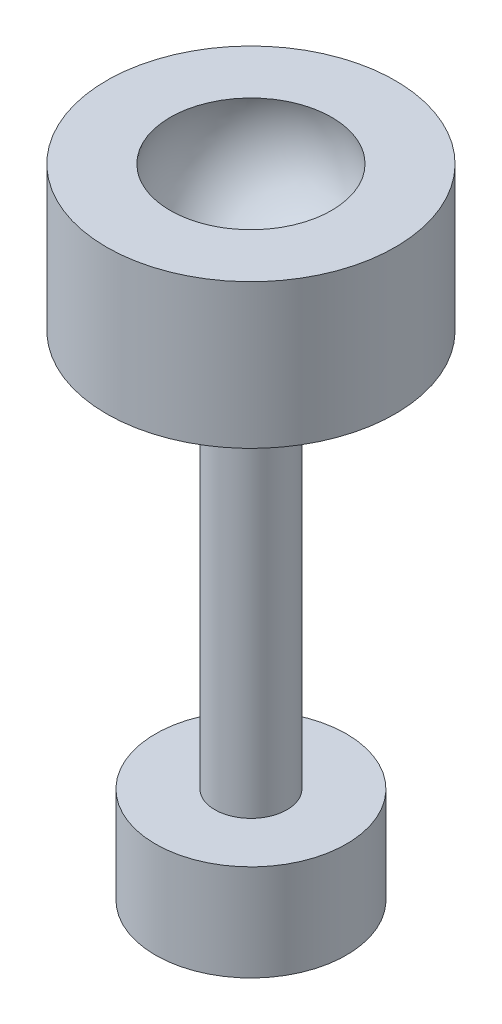
ISO-10303-21;
HEADER;
FILE_DESCRIPTION(('STEP AP214'),'2;1');
FILE_NAME('part.step','',(''),(''),'','','');
FILE_SCHEMA(('AUTOMOTIVE_DESIGN { 1 0 10303 214 1 1 1 1 }'));
ENDSEC;
DATA;
#1=APPLICATION_CONTEXT('core data for automotive mechanical design processes');
#2=APPLICATION_PROTOCOL_DEFINITION('international standard','automotive_design',2000,#1);
#3=PRODUCT_CONTEXT('',#1,'mechanical');
#4=PRODUCT('Part','Part','',(#3));
#5=PRODUCT_RELATED_PRODUCT_CATEGORY('part','',(#4));
#6=PRODUCT_DEFINITION_FORMATION('','',#4);
#7=PRODUCT_DEFINITION_CONTEXT('part definition',#1,'design');
#8=PRODUCT_DEFINITION('design','',#6,#7);
#9=PRODUCT_DEFINITION_SHAPE('','',#8);
#10=(LENGTH_UNIT() NAMED_UNIT(*) SI_UNIT(.MILLI.,.METRE.));
#11=(NAMED_UNIT(*) PLANE_ANGLE_UNIT() SI_UNIT($,.RADIAN.));
#12=(NAMED_UNIT(*) SI_UNIT($,.STERADIAN.) SOLID_ANGLE_UNIT());
#13=UNCERTAINTY_MEASURE_WITH_UNIT(LENGTH_MEASURE(1.E-05),#10,'distance_accuracy_value','');
#14=(GEOMETRIC_REPRESENTATION_CONTEXT(3) GLOBAL_UNCERTAINTY_ASSIGNED_CONTEXT((#13)) GLOBAL_UNIT_ASSIGNED_CONTEXT((#10,
#11,#12)) REPRESENTATION_CONTEXT('',''));
#15=CARTESIAN_POINT('',(0.,0.,0.));
#16=DIRECTION('',(0.,0.,1.));
#17=DIRECTION('',(1.,0.,0.));
#18=AXIS2_PLACEMENT_3D('',#15,#16,#17);
#19=CARTESIAN_POINT('',(0.,33.,0.));
#20=DIRECTION('',(0.,1.,0.));
#21=DIRECTION('',(0.,0.,1.));
#22=AXIS2_PLACEMENT_3D('',#19,#20,#21);
#23=PLANE('',#22);
#24=CARTESIAN_POINT('',(0.,33.,0.));
#25=DIRECTION('',(0.,1.,0.));
#26=DIRECTION('',(0.,0.,1.));
#27=AXIS2_PLACEMENT_3D('',#24,#25,#26);
#28=CIRCLE('',#27,12.);
#29=CARTESIAN_POINT('',(0.,33.,12.));
#30=VERTEX_POINT('',#29);
#31=EDGE_CURVE('E11',#30,#30,#28,.T.);
#32=ORIENTED_EDGE('',*,*,#31,.F.);
#33=EDGE_LOOP('',(#32));
#34=FACE_BOUND('',#33,.T.);
#35=CARTESIAN_POINT('',(0.,33.,0.));
#36=DIRECTION('',(0.,1.,0.));
#37=DIRECTION('',(0.,0.,1.));
#38=AXIS2_PLACEMENT_3D('',#35,#36,#37);
#39=CIRCLE('',#38,3.);
#40=CARTESIAN_POINT('',(0.,33.,3.));
#41=VERTEX_POINT('',#40);
#42=EDGE_CURVE('E61',#41,#41,#39,.T.);
#43=ORIENTED_EDGE('',*,*,#42,.T.);
#44=EDGE_LOOP('',(#43));
#45=FACE_BOUND('',#44,.T.);
#46=ADVANCED_FACE('F16',(#34,#45),#23,.F.);
#47=CARTESIAN_POINT('',(0.,39.,0.));
#48=DIRECTION('',(0.,1.,0.));
#49=DIRECTION('',(0.,0.,1.));
#50=AXIS2_PLACEMENT_3D('',#47,#48,#49);
#51=CYLINDRICAL_SURFACE('',#50,12.);
#52=CARTESIAN_POINT('',(0.,45.,0.));
#53=DIRECTION('',(0.,1.,0.));
#54=DIRECTION('',(0.,0.,1.));
#55=AXIS2_PLACEMENT_3D('',#52,#53,#54);
#56=CIRCLE('',#55,12.);
#57=CARTESIAN_POINT('',(0.,45.,12.));
#58=VERTEX_POINT('',#57);
#59=EDGE_CURVE('E28',#58,#58,#56,.T.);
#60=ORIENTED_EDGE('',*,*,#59,.F.);
#61=EDGE_LOOP('',(#60));
#62=FACE_BOUND('',#61,.T.);
#63=ORIENTED_EDGE('',*,*,#31,.T.);
#64=EDGE_LOOP('',(#63));
#65=FACE_BOUND('',#64,.T.);
#66=ADVANCED_FACE('F75',(#62,#65),#51,.T.);
#67=CARTESIAN_POINT('',(0.,16.5,0.));
#68=DIRECTION('',(0.,1.,0.));
#69=DIRECTION('',(0.,0.,1.));
#70=AXIS2_PLACEMENT_3D('',#67,#68,#69);
#71=CYLINDRICAL_SURFACE('',#70,3.);
#72=ORIENTED_EDGE('',*,*,#42,.F.);
#73=EDGE_LOOP('',(#72));
#74=FACE_BOUND('',#73,.T.);
#75=CARTESIAN_POINT('',(0.,0.,0.));
#76=DIRECTION('',(0.,1.,0.));
#77=DIRECTION('',(0.,0.,1.));
#78=AXIS2_PLACEMENT_3D('',#75,#76,#77);
#79=CIRCLE('',#78,3.);
#80=CARTESIAN_POINT('',(0.,0.,3.));
#81=VERTEX_POINT('',#80);
#82=EDGE_CURVE('E57',#81,#81,#79,.T.);
#83=ORIENTED_EDGE('',*,*,#82,.T.);
#84=EDGE_LOOP('',(#83));
#85=FACE_BOUND('',#84,.T.);
#86=ADVANCED_FACE('F71',(#74,#85),#71,.T.);
#87=CARTESIAN_POINT('',(0.,0.,0.));
#88=DIRECTION('',(0.,1.,0.));
#89=DIRECTION('',(0.,0.,1.));
#90=AXIS2_PLACEMENT_3D('',#87,#88,#89);
#91=PLANE('',#90);
#92=CARTESIAN_POINT('',(0.,0.,0.));
#93=DIRECTION('',(0.,1.,0.));
#94=DIRECTION('',(0.,0.,1.));
#95=AXIS2_PLACEMENT_3D('',#92,#93,#94);
#96=CIRCLE('',#95,7.9375);
#97=CARTESIAN_POINT('',(0.,0.,7.9375));
#98=VERTEX_POINT('',#97);
#99=EDGE_CURVE('E46',#98,#98,#96,.T.);
#100=ORIENTED_EDGE('',*,*,#99,.T.);
#101=EDGE_LOOP('',(#100));
#102=FACE_BOUND('',#101,.T.);
#103=ORIENTED_EDGE('',*,*,#82,.F.);
#104=EDGE_LOOP('',(#103));
#105=FACE_BOUND('',#104,.T.);
#106=ADVANCED_FACE('F74',(#102,#105),#91,.T.);
#107=CARTESIAN_POINT('',(0.,-4.,0.));
#108=DIRECTION('',(0.,1.,0.));
#109=DIRECTION('',(0.,0.,1.));
#110=AXIS2_PLACEMENT_3D('',#107,#108,#109);
#111=CYLINDRICAL_SURFACE('',#110,7.9375);
#112=CARTESIAN_POINT('',(0.,-8.,0.));
#113=DIRECTION('',(0.,1.,0.));
#114=DIRECTION('',(0.,0.,1.));
#115=AXIS2_PLACEMENT_3D('',#112,#113,#114);
#116=CIRCLE('',#115,7.9375);
#117=CARTESIAN_POINT('',(0.,-8.,7.9375));
#118=VERTEX_POINT('',#117);
#119=EDGE_CURVE('E41',#118,#118,#116,.T.);
#120=ORIENTED_EDGE('',*,*,#119,.T.);
#121=EDGE_LOOP('',(#120));
#122=FACE_BOUND('',#121,.T.);
#123=ORIENTED_EDGE('',*,*,#99,.F.);
#124=EDGE_LOOP('',(#123));
#125=FACE_BOUND('',#124,.T.);
#126=ADVANCED_FACE('F80',(#122,#125),#111,.T.);
#127=CARTESIAN_POINT('',(0.,-8.,0.));
#128=DIRECTION('',(0.,1.,0.));
#129=DIRECTION('',(0.,0.,1.));
#130=AXIS2_PLACEMENT_3D('',#127,#128,#129);
#131=PLANE('',#130);
#132=ORIENTED_EDGE('',*,*,#119,.F.);
#133=EDGE_LOOP('',(#132));
#134=FACE_BOUND('',#133,.T.);
#135=ADVANCED_FACE('F87',(#134),#131,.F.);
#136=CARTESIAN_POINT('',(0.,45.,0.));
#137=DIRECTION('',(0.,1.,0.));
#138=DIRECTION('',(0.,0.,1.));
#139=AXIS2_PLACEMENT_3D('',#136,#137,#138);
#140=PLANE('',#139);
#141=ORIENTED_EDGE('',*,*,#59,.T.);
#142=EDGE_LOOP('',(#141));
#143=FACE_BOUND('',#142,.T.);
#144=CARTESIAN_POINT('',(-6.70820393249937,45.,0.));
#145=CARTESIAN_POINT('',(-6.70820393249937,45.,0.679038830081476));
#146=CARTESIAN_POINT('',(-6.62228418829698,45.,1.35807721706426));
#147=CARTESIAN_POINT('',(-6.45041970525023,45.,2.02264916167728));
#148=CARTESIAN_POINT('',(-5.94223076014665,45.,3.29399991246659));
#149=CARTESIAN_POINT('',(-5.13334229459736,45.,4.3986740232821));
#150=CARTESIAN_POINT('',(-4.66062098040392,45.,4.89674899942148));
#151=CARTESIAN_POINT('',(-3.59947915930184,45.,5.76235342041491));
#152=CARTESIAN_POINT('',(-2.35612912667693,45.,6.33626008107792));
#153=CARTESIAN_POINT('',(-1.7011712337377,45.,6.54259544215959));
#154=CARTESIAN_POINT('',(-0.353381238165525,45.,6.78498996761062));
#155=CARTESIAN_POINT('',(1.01229556558579,45.,6.68392055342444));
#156=CARTESIAN_POINT('',(1.68514477711267,45.,6.54674161445848));
#157=CARTESIAN_POINT('',(2.98138884364285,45.,6.10510341624312));
#158=CARTESIAN_POINT('',(4.12671006900359,45.,5.35441876238938));
#159=CARTESIAN_POINT('',(4.6486159611967,45.,4.90814713833714));
#160=CARTESIAN_POINT('',(5.56805415355231,45.,3.89329424821607));
#161=CARTESIAN_POINT('',(6.20563015797126,45.,2.68135984512789));
#162=CARTESIAN_POINT('',(6.44563353400054,45.,2.03797620978373));
#163=CARTESIAN_POINT('',(6.63358875579917,45.,1.23449920338931));
#164=CARTESIAN_POINT('',(6.69733943544803,45.,0.418072944752705));
#165=CARTESIAN_POINT('',(6.70458554985139,45.,0.278698951316134));
#166=CARTESIAN_POINT('',(6.70820393249937,45.,0.139349484988288));
#167=CARTESIAN_POINT('',(6.70820393249937,45.,0.));
#168=B_SPLINE_CURVE_WITH_KNOTS('',5,(#144,#145,#146,#147,#148,#149,#150,#151,#152,#153,#154,
#155,#156,#157,#158,#159,#160,#161,#162,#163,#164,#165,#166,#167),.UNSPECIFIED.,.F.,.F.,(6,3,3,
3,3,3,3,6),(0.,4.90707034567309,9.8159279742335,14.7247856027843,19.6336432313441,
24.5425008599133,29.4513584884886,30.4583667701634),.UNSPECIFIED.);
#169=CARTESIAN_POINT('',(-6.70820393249937,45.,0.));
#170=VERTEX_POINT('',#169);
#171=CARTESIAN_POINT('',(6.70820393249937,45.,0.));
#172=VERTEX_POINT('',#171);
#173=EDGE_CURVE('E37',#170,#172,#168,.T.);
#174=ORIENTED_EDGE('',*,*,#173,.F.);
#175=CARTESIAN_POINT('',(6.70820393249937,45.,0.));
#176=CARTESIAN_POINT('',(6.70820393249937,45.,-0.679038830090302));
#177=CARTESIAN_POINT('',(6.62228418829577,45.,-1.35807721708191));
#178=CARTESIAN_POINT('',(6.45041970524129,45.,-2.02264916171122));
#179=CARTESIAN_POINT('',(5.94223076012741,45.,-3.29399991250226));
#180=CARTESIAN_POINT('',(5.13334229456391,45.,-4.39867402332267));
#181=CARTESIAN_POINT('',(4.66062098036519,45.,-4.89674899945555));
#182=CARTESIAN_POINT('',(3.59947915925935,45.,-5.76235342044383));
#183=CARTESIAN_POINT('',(2.35612912662496,45.,-6.33626008109576));
#184=CARTESIAN_POINT('',(1.70117123369173,45.,-6.54259544217205));
#185=CARTESIAN_POINT('',(0.353381238113299,45.,-6.78498996761358));
#186=CARTESIAN_POINT('',(-1.012295565639,45.,-6.68392055341667));
#187=CARTESIAN_POINT('',(-1.68514477715646,45.,-6.54674161444466));
#188=CARTESIAN_POINT('',(-2.98138884369151,45.,-6.10510341622324));
#189=CARTESIAN_POINT('',(-4.12671006904553,45.,-5.35441876235358));
#190=CARTESIAN_POINT('',(-4.64861596123036,45.,-4.90814713830625));
#191=CARTESIAN_POINT('',(-5.56805415358458,45.,-3.89329424817124));
#192=CARTESIAN_POINT('',(-6.20563015799628,45.,-2.68135984507222));
#193=CARTESIAN_POINT('',(-6.44563353401294,45.,-2.03797620974528));
#194=CARTESIAN_POINT('',(-6.63358875580581,45.,-1.23449920335486));
#195=CARTESIAN_POINT('',(-6.69733943544958,45.,-0.41807294472239));
#196=CARTESIAN_POINT('',(-6.70458554985187,45.,-0.278698951295946));
#197=CARTESIAN_POINT('',(-6.70820393249937,45.,-0.139349484978195));
#198=CARTESIAN_POINT('',(-6.70820393249937,45.,0.));
#199=B_SPLINE_CURVE_WITH_KNOTS('',5,(#175,#176,#177,#178,#179,#180,#181,#182,#183,#184,#185,
#186,#187,#188,#189,#190,#191,#192,#193,#194,#195,#196,#197,#198),.UNSPECIFIED.,.F.,.F.,(6,3,3,
3,3,3,3,6),(0.,4.90707034573687,9.81592797429738,14.7247856028576,19.6336432314303,
24.5425008600155,29.4513584886302,30.4583667702321),.UNSPECIFIED.);
#200=EDGE_CURVE('E20',#172,#170,#199,.T.);
#201=ORIENTED_EDGE('',*,*,#200,.F.);
#202=EDGE_LOOP('',(#174,#201));
#203=FACE_BOUND('',#202,.T.);
#204=ADVANCED_FACE('F39',(#143,#203),#140,.T.);
#205=CARTESIAN_POINT('',(0.,43.,0.));
#206=DIRECTION('',(0.,0.,1.));
#207=DIRECTION('',(1.,0.,0.));
#208=AXIS2_PLACEMENT_3D('',#205,#206,#207);
#209=SPHERICAL_SURFACE('',#208,7.);
#210=ORIENTED_EDGE('',*,*,#173,.T.);
#211=ORIENTED_EDGE('',*,*,#200,.T.);
#212=EDGE_LOOP('',(#210,#211));
#213=FACE_BOUND('',#212,.T.);
#214=ADVANCED_FACE('F18',(#213),#209,.F.);
#215=CLOSED_SHELL('',(#46,#66,#86,#106,#126,#135,#204,#214));
#216=MANIFOLD_SOLID_BREP('B1',#215);
#217=ADVANCED_BREP_SHAPE_REPRESENTATION('',(#18,#216),#14);
#218=SHAPE_DEFINITION_REPRESENTATION(#9,#217);
ENDSEC;
END-ISO-10303-21;
